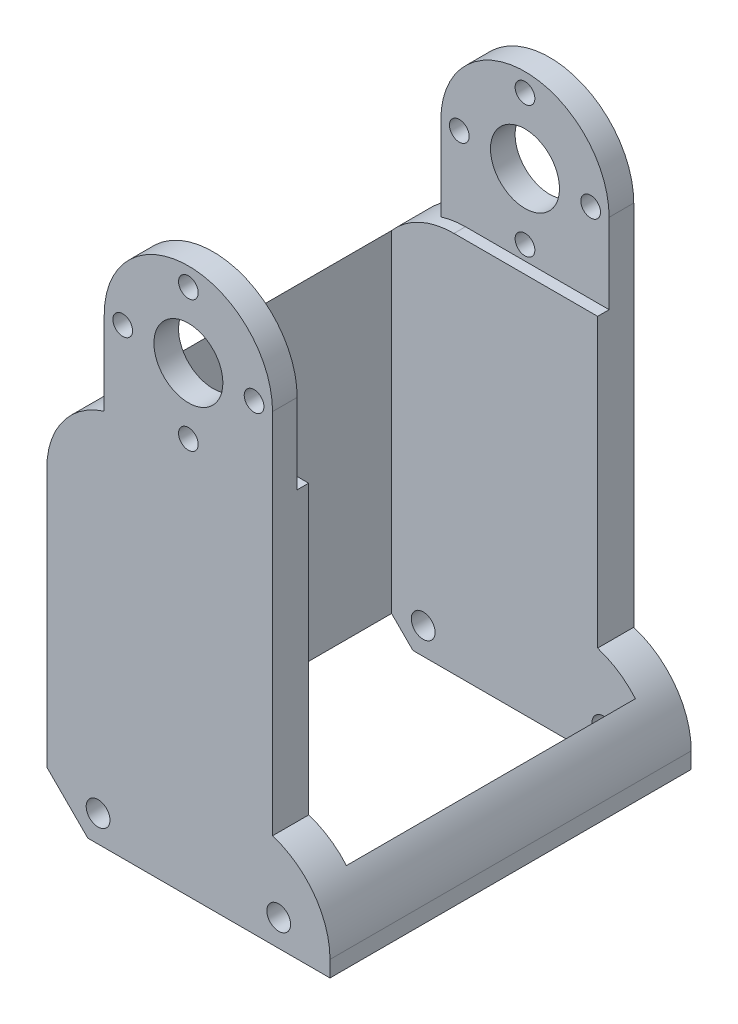
ISO-10303-21;
HEADER;
FILE_DESCRIPTION(('STEP AP214'),'2;1');
FILE_NAME('part.step','',(''),(''),'','','');
FILE_SCHEMA(('AUTOMOTIVE_DESIGN { 1 0 10303 214 1 1 1 1 }'));
ENDSEC;
DATA;
#1=APPLICATION_CONTEXT('core data for automotive mechanical design processes');
#2=APPLICATION_PROTOCOL_DEFINITION('international standard','automotive_design',2000,#1);
#3=PRODUCT_CONTEXT('',#1,'mechanical');
#4=PRODUCT('Part','Part','',(#3));
#5=PRODUCT_RELATED_PRODUCT_CATEGORY('part','',(#4));
#6=PRODUCT_DEFINITION_FORMATION('','',#4);
#7=PRODUCT_DEFINITION_CONTEXT('part definition',#1,'design');
#8=PRODUCT_DEFINITION('design','',#6,#7);
#9=PRODUCT_DEFINITION_SHAPE('','',#8);
#10=(LENGTH_UNIT() NAMED_UNIT(*) SI_UNIT(.MILLI.,.METRE.));
#11=(NAMED_UNIT(*) PLANE_ANGLE_UNIT() SI_UNIT($,.RADIAN.));
#12=(NAMED_UNIT(*) SI_UNIT($,.STERADIAN.) SOLID_ANGLE_UNIT());
#13=UNCERTAINTY_MEASURE_WITH_UNIT(LENGTH_MEASURE(1.E-05),#10,'distance_accuracy_value','');
#14=(GEOMETRIC_REPRESENTATION_CONTEXT(3) GLOBAL_UNCERTAINTY_ASSIGNED_CONTEXT((#13)) GLOBAL_UNIT_ASSIGNED_CONTEXT((#10,
#11,#12)) REPRESENTATION_CONTEXT('',''));
#15=CARTESIAN_POINT('',(0.,0.,0.));
#16=DIRECTION('',(0.,0.,1.));
#17=DIRECTION('',(1.,0.,0.));
#18=AXIS2_PLACEMENT_3D('',#15,#16,#17);
#19=CARTESIAN_POINT('',(10.25,-9.75,-19.));
#20=DIRECTION('',(0.,-1.,0.));
#21=DIRECTION('',(0.,0.,-1.));
#22=AXIS2_PLACEMENT_3D('',#19,#20,#21);
#23=PLANE('',#22);
#24=DIRECTION('',(-1.,0.,0.));
#25=VECTOR('',#24,1.);
#26=CARTESIAN_POINT('',(10.25,-9.75,-19.));
#27=LINE('',#26,#25);
#28=CARTESIAN_POINT('',(10.25,-9.75,-19.));
#29=VERTEX_POINT('',#28);
#30=CARTESIAN_POINT('',(-7.25,-9.75,-19.));
#31=VERTEX_POINT('',#30);
#32=EDGE_CURVE('E391',#29,#31,#27,.T.);
#33=ORIENTED_EDGE('',*,*,#32,.T.);
#34=DIRECTION('',(0.,0.,1.));
#35=VECTOR('',#34,1.);
#36=CARTESIAN_POINT('',(-7.25,-9.75,22.));
#37=LINE('',#36,#35);
#38=CARTESIAN_POINT('',(-7.25,-9.75,-17.6));
#39=VERTEX_POINT('',#38);
#40=EDGE_CURVE('E564',#31,#39,#37,.T.);
#41=ORIENTED_EDGE('',*,*,#40,.T.);
#42=DIRECTION('',(1.,0.,0.));
#43=VECTOR('',#42,1.);
#44=CARTESIAN_POINT('',(10.25,-9.75,-17.6));
#45=LINE('',#44,#43);
#46=CARTESIAN_POINT('',(10.25,-9.75,-17.6));
#47=VERTEX_POINT('',#46);
#48=EDGE_CURVE('E332',#39,#47,#45,.T.);
#49=ORIENTED_EDGE('',*,*,#48,.T.);
#50=DIRECTION('',(0.,0.,-1.));
#51=VECTOR('',#50,1.);
#52=CARTESIAN_POINT('',(10.25,-9.75,22.));
#53=LINE('',#52,#51);
#54=EDGE_CURVE('E291',#47,#29,#53,.T.);
#55=ORIENTED_EDGE('',*,*,#54,.T.);
#56=EDGE_LOOP('',(#33,#41,#49,#55));
#57=FACE_BOUND('',#56,.T.);
#58=ADVANCED_FACE('F108',(#57),#23,.F.);
#59=CARTESIAN_POINT('',(0.,0.,-22.));
#60=DIRECTION('',(0.,0.,1.));
#61=DIRECTION('',(1.,0.,0.));
#62=AXIS2_PLACEMENT_3D('',#59,#60,#61);
#63=PLANE('',#62);
#64=CARTESIAN_POINT('',(-8.,0.,-22.));
#65=DIRECTION('',(0.,0.,1.));
#66=DIRECTION('',(1.,0.,0.));
#67=AXIS2_PLACEMENT_3D('',#64,#65,#66);
#68=CIRCLE('',#67,1.2);
#69=CARTESIAN_POINT('',(-6.8,0.,-22.));
#70=VERTEX_POINT('',#69);
#71=EDGE_CURVE('E467',#70,#70,#68,.T.);
#72=ORIENTED_EDGE('',*,*,#71,.T.);
#73=EDGE_LOOP('',(#72));
#74=FACE_BOUND('',#73,.T.);
#75=CARTESIAN_POINT('',(0.,8.,-22.));
#76=DIRECTION('',(0.,0.,1.));
#77=DIRECTION('',(1.,0.,0.));
#78=AXIS2_PLACEMENT_3D('',#75,#76,#77);
#79=CIRCLE('',#78,1.2);
#80=CARTESIAN_POINT('',(1.2,8.,-22.));
#81=VERTEX_POINT('',#80);
#82=EDGE_CURVE('E471',#81,#81,#79,.T.);
#83=ORIENTED_EDGE('',*,*,#82,.T.);
#84=EDGE_LOOP('',(#83));
#85=FACE_BOUND('',#84,.T.);
#86=CARTESIAN_POINT('',(8.,0.,-22.));
#87=DIRECTION('',(0.,0.,1.));
#88=DIRECTION('',(1.,0.,0.));
#89=AXIS2_PLACEMENT_3D('',#86,#87,#88);
#90=CIRCLE('',#89,1.2);
#91=CARTESIAN_POINT('',(9.2,0.,-22.));
#92=VERTEX_POINT('',#91);
#93=EDGE_CURVE('E475',#92,#92,#90,.T.);
#94=ORIENTED_EDGE('',*,*,#93,.T.);
#95=EDGE_LOOP('',(#94));
#96=FACE_BOUND('',#95,.T.);
#97=CARTESIAN_POINT('',(0.,0.,-22.));
#98=DIRECTION('',(0.,0.,1.));
#99=DIRECTION('',(1.,0.,0.));
#100=AXIS2_PLACEMENT_3D('',#97,#98,#99);
#101=CIRCLE('',#100,4.2);
#102=CARTESIAN_POINT('',(4.2,0.,-22.));
#103=VERTEX_POINT('',#102);
#104=EDGE_CURVE('E479',#103,#103,#101,.T.);
#105=ORIENTED_EDGE('',*,*,#104,.T.);
#106=EDGE_LOOP('',(#105));
#107=FACE_BOUND('',#106,.T.);
#108=CARTESIAN_POINT('',(0.,-8.,-22.));
#109=DIRECTION('',(0.,0.,1.));
#110=DIRECTION('',(1.,0.,0.));
#111=AXIS2_PLACEMENT_3D('',#108,#109,#110);
#112=CIRCLE('',#111,1.2);
#113=CARTESIAN_POINT('',(1.19999999999994,-8.,-22.));
#114=VERTEX_POINT('',#113);
#115=EDGE_CURVE('E493',#114,#114,#112,.T.);
#116=ORIENTED_EDGE('',*,*,#115,.T.);
#117=EDGE_LOOP('',(#116));
#118=FACE_BOUND('',#117,.T.);
#119=CARTESIAN_POINT('',(11.,-53.,-22.));
#120=DIRECTION('',(0.,0.,1.));
#121=DIRECTION('',(1.,0.,0.));
#122=AXIS2_PLACEMENT_3D('',#119,#120,#121);
#123=CIRCLE('',#122,1.45);
#124=CARTESIAN_POINT('',(12.45,-53.,-22.));
#125=VERTEX_POINT('',#124);
#126=EDGE_CURVE('E364',#125,#125,#123,.T.);
#127=ORIENTED_EDGE('',*,*,#126,.T.);
#128=EDGE_LOOP('',(#127));
#129=FACE_BOUND('',#128,.T.);
#130=CARTESIAN_POINT('',(-11.,-53.,-22.));
#131=DIRECTION('',(0.,0.,1.));
#132=DIRECTION('',(1.,0.,0.));
#133=AXIS2_PLACEMENT_3D('',#130,#131,#132);
#134=CIRCLE('',#133,1.45);
#135=CARTESIAN_POINT('',(-9.55,-53.,-22.));
#136=VERTEX_POINT('',#135);
#137=EDGE_CURVE('E352',#136,#136,#134,.T.);
#138=ORIENTED_EDGE('',*,*,#137,.T.);
#139=EDGE_LOOP('',(#138));
#140=FACE_BOUND('',#139,.T.);
#141=CARTESIAN_POINT('',(-7.25,-19.75,-22.));
#142=DIRECTION('',(0.,0.,1.));
#143=DIRECTION('',(1.,0.,0.));
#144=AXIS2_PLACEMENT_3D('',#141,#142,#143);
#145=CIRCLE('',#144,10.);
#146=CARTESIAN_POINT('',(-17.25,-19.75,-22.));
#147=VERTEX_POINT('',#146);
#148=CARTESIAN_POINT('',(-10.25,-10.2106079858305,-22.));
#149=VERTEX_POINT('',#148);
#150=EDGE_CURVE('E583',#147,#149,#145,.F.);
#151=ORIENTED_EDGE('',*,*,#150,.T.);
#152=DIRECTION('',(0.,-1.,0.));
#153=VECTOR('',#152,1.);
#154=CARTESIAN_POINT('',(-10.25,0.,-22.));
#155=LINE('',#154,#153);
#156=CARTESIAN_POINT('',(-10.25,0.,-22.));
#157=VERTEX_POINT('',#156);
#158=EDGE_CURVE('E487',#157,#149,#155,.T.);
#159=ORIENTED_EDGE('',*,*,#158,.F.);
#160=CARTESIAN_POINT('',(0.,0.,-22.));
#161=DIRECTION('',(0.,0.,1.));
#162=DIRECTION('',(1.,0.,0.));
#163=AXIS2_PLACEMENT_3D('',#160,#161,#162);
#164=CIRCLE('',#163,10.25);
#165=CARTESIAN_POINT('',(10.25,0.,-22.));
#166=VERTEX_POINT('',#165);
#167=EDGE_CURVE('E483',#166,#157,#164,.T.);
#168=ORIENTED_EDGE('',*,*,#167,.F.);
#169=DIRECTION('',(0.,-1.,0.));
#170=VECTOR('',#169,1.);
#171=CARTESIAN_POINT('',(10.25,0.,-22.));
#172=LINE('',#171,#170);
#173=CARTESIAN_POINT('',(10.25,-44.75,-22.));
#174=VERTEX_POINT('',#173);
#175=EDGE_CURVE('E490',#166,#174,#172,.T.);
#176=ORIENTED_EDGE('',*,*,#175,.T.);
#177=CARTESIAN_POINT('',(7.25,-54.2893920141695,-22.));
#178=DIRECTION('',(0.,0.,1.));
#179=DIRECTION('',(1.,0.,0.));
#180=AXIS2_PLACEMENT_3D('',#177,#178,#179);
#181=CIRCLE('',#180,10.);
#182=CARTESIAN_POINT('',(17.25,-54.2893920141695,-22.));
#183=VERTEX_POINT('',#182);
#184=EDGE_CURVE('E557',#174,#183,#181,.F.);
#185=ORIENTED_EDGE('',*,*,#184,.T.);
#186=DIRECTION('',(0.,1.,0.));
#187=VECTOR('',#186,1.);
#188=CARTESIAN_POINT('',(17.25,-75.25,-22.));
#189=LINE('',#188,#187);
#190=CARTESIAN_POINT('',(17.25,-56.25,-22.));
#191=VERTEX_POINT('',#190);
#192=EDGE_CURVE('E356',#191,#183,#189,.T.);
#193=ORIENTED_EDGE('',*,*,#192,.F.);
#194=DIRECTION('',(1.,0.,0.));
#195=VECTOR('',#194,1.);
#196=CARTESIAN_POINT('',(0.,-56.25,-22.));
#197=LINE('',#196,#195);
#198=CARTESIAN_POINT('',(-12.25,-56.25,-22.));
#199=VERTEX_POINT('',#198);
#200=EDGE_CURVE('E345',#199,#191,#197,.T.);
#201=ORIENTED_EDGE('',*,*,#200,.F.);
#202=DIRECTION('',(0.707106781186544,-0.707106781186551,0.));
#203=VECTOR('',#202,1.);
#204=CARTESIAN_POINT('',(-17.25,-51.2499999999999,-22.));
#205=LINE('',#204,#203);
#206=CARTESIAN_POINT('',(-17.25,-51.2499999999999,-22.));
#207=VERTEX_POINT('',#206);
#208=EDGE_CURVE('E546',#199,#207,#205,.F.);
#209=ORIENTED_EDGE('',*,*,#208,.T.);
#210=DIRECTION('',(0.,1.,0.));
#211=VECTOR('',#210,1.);
#212=CARTESIAN_POINT('',(-17.25,-75.25,-22.));
#213=LINE('',#212,#211);
#214=EDGE_CURVE('E373',#207,#147,#213,.T.);
#215=ORIENTED_EDGE('',*,*,#214,.T.);
#216=EDGE_LOOP('',(#151,#159,#168,#176,#185,#193,#201,#209,#215));
#217=FACE_BOUND('',#216,.T.);
#218=ADVANCED_FACE('F619',(#74,#85,#96,#107,#118,#129,#140,#217),#63,.F.);
#219=CARTESIAN_POINT('',(0.,0.,22.));
#220=DIRECTION('',(0.,0.,1.));
#221=DIRECTION('',(1.,0.,0.));
#222=AXIS2_PLACEMENT_3D('',#219,#220,#221);
#223=PLANE('',#222);
#224=DIRECTION('',(0.,-1.,0.));
#225=VECTOR('',#224,1.);
#226=CARTESIAN_POINT('',(-10.25,0.,22.));
#227=LINE('',#226,#225);
#228=CARTESIAN_POINT('',(-10.25,0.,22.));
#229=VERTEX_POINT('',#228);
#230=CARTESIAN_POINT('',(-10.25,-10.2106079858305,22.));
#231=VERTEX_POINT('',#230);
#232=EDGE_CURVE('E285',#229,#231,#227,.T.);
#233=ORIENTED_EDGE('',*,*,#232,.T.);
#234=CARTESIAN_POINT('',(-7.25,-19.75,22.));
#235=DIRECTION('',(0.,0.,1.));
#236=DIRECTION('',(1.,0.,0.));
#237=AXIS2_PLACEMENT_3D('',#234,#235,#236);
#238=CIRCLE('',#237,10.);
#239=CARTESIAN_POINT('',(-17.25,-19.75,22.));
#240=VERTEX_POINT('',#239);
#241=EDGE_CURVE('E577',#231,#240,#238,.T.);
#242=ORIENTED_EDGE('',*,*,#241,.T.);
#243=DIRECTION('',(0.,1.,0.));
#244=VECTOR('',#243,1.);
#245=CARTESIAN_POINT('',(-17.25,-75.25,22.));
#246=LINE('',#245,#244);
#247=CARTESIAN_POINT('',(-17.25,-51.2499999999999,22.));
#248=VERTEX_POINT('',#247);
#249=EDGE_CURVE('E377',#248,#240,#246,.T.);
#250=ORIENTED_EDGE('',*,*,#249,.F.);
#251=DIRECTION('',(-0.707106781186544,0.707106781186551,0.));
#252=VECTOR('',#251,1.);
#253=CARTESIAN_POINT('',(-34.25,-34.2499999999997,22.));
#254=LINE('',#253,#252);
#255=CARTESIAN_POINT('',(-12.25,-56.25,22.));
#256=VERTEX_POINT('',#255);
#257=EDGE_CURVE('E526',#248,#256,#254,.F.);
#258=ORIENTED_EDGE('',*,*,#257,.T.);
#259=DIRECTION('',(1.,0.,0.));
#260=VECTOR('',#259,1.);
#261=CARTESIAN_POINT('',(0.,-56.25,22.));
#262=LINE('',#261,#260);
#263=CARTESIAN_POINT('',(17.25,-56.25,22.));
#264=VERTEX_POINT('',#263);
#265=EDGE_CURVE('E349',#256,#264,#262,.T.);
#266=ORIENTED_EDGE('',*,*,#265,.T.);
#267=DIRECTION('',(0.,1.,0.));
#268=VECTOR('',#267,1.);
#269=CARTESIAN_POINT('',(17.25,-75.25,22.));
#270=LINE('',#269,#268);
#271=CARTESIAN_POINT('',(17.25,-54.2893920141695,22.));
#272=VERTEX_POINT('',#271);
#273=EDGE_CURVE('E266',#264,#272,#270,.T.);
#274=ORIENTED_EDGE('',*,*,#273,.T.);
#275=CARTESIAN_POINT('',(7.25,-54.2893920141695,22.));
#276=DIRECTION('',(0.,0.,1.));
#277=DIRECTION('',(1.,0.,0.));
#278=AXIS2_PLACEMENT_3D('',#275,#276,#277);
#279=CIRCLE('',#278,10.);
#280=CARTESIAN_POINT('',(10.25,-44.75,22.));
#281=VERTEX_POINT('',#280);
#282=EDGE_CURVE('E259',#272,#281,#279,.T.);
#283=ORIENTED_EDGE('',*,*,#282,.T.);
#284=DIRECTION('',(0.,-1.,0.));
#285=VECTOR('',#284,1.);
#286=CARTESIAN_POINT('',(10.25,0.,22.));
#287=LINE('',#286,#285);
#288=CARTESIAN_POINT('',(10.25,0.,22.));
#289=VERTEX_POINT('',#288);
#290=EDGE_CURVE('E264',#289,#281,#287,.T.);
#291=ORIENTED_EDGE('',*,*,#290,.F.);
#292=CARTESIAN_POINT('',(0.,0.,22.));
#293=DIRECTION('',(0.,0.,1.));
#294=DIRECTION('',(1.,0.,0.));
#295=AXIS2_PLACEMENT_3D('',#292,#293,#294);
#296=CIRCLE('',#295,10.25);
#297=EDGE_CURVE('E459',#289,#229,#296,.T.);
#298=ORIENTED_EDGE('',*,*,#297,.T.);
#299=EDGE_LOOP('',(#233,#242,#250,#258,#266,#274,#283,#291,#298));
#300=FACE_BOUND('',#299,.T.);
#301=CARTESIAN_POINT('',(0.,-8.,22.));
#302=DIRECTION('',(0.,0.,1.));
#303=DIRECTION('',(1.,0.,0.));
#304=AXIS2_PLACEMENT_3D('',#301,#302,#303);
#305=CIRCLE('',#304,1.2);
#306=CARTESIAN_POINT('',(1.19999999999994,-8.,22.));
#307=VERTEX_POINT('',#306);
#308=EDGE_CURVE('E284',#307,#307,#305,.T.);
#309=ORIENTED_EDGE('',*,*,#308,.F.);
#310=EDGE_LOOP('',(#309));
#311=FACE_BOUND('',#310,.T.);
#312=CARTESIAN_POINT('',(0.,0.,22.));
#313=DIRECTION('',(0.,0.,1.));
#314=DIRECTION('',(1.,0.,0.));
#315=AXIS2_PLACEMENT_3D('',#312,#313,#314);
#316=CIRCLE('',#315,4.2);
#317=CARTESIAN_POINT('',(4.2,0.,22.));
#318=VERTEX_POINT('',#317);
#319=EDGE_CURVE('E455',#318,#318,#316,.T.);
#320=ORIENTED_EDGE('',*,*,#319,.F.);
#321=EDGE_LOOP('',(#320));
#322=FACE_BOUND('',#321,.T.);
#323=CARTESIAN_POINT('',(8.,0.,22.));
#324=DIRECTION('',(0.,0.,1.));
#325=DIRECTION('',(1.,0.,0.));
#326=AXIS2_PLACEMENT_3D('',#323,#324,#325);
#327=CIRCLE('',#326,1.2);
#328=CARTESIAN_POINT('',(9.2,0.,22.));
#329=VERTEX_POINT('',#328);
#330=EDGE_CURVE('E451',#329,#329,#327,.T.);
#331=ORIENTED_EDGE('',*,*,#330,.F.);
#332=EDGE_LOOP('',(#331));
#333=FACE_BOUND('',#332,.T.);
#334=CARTESIAN_POINT('',(0.,8.,22.));
#335=DIRECTION('',(0.,0.,1.));
#336=DIRECTION('',(1.,0.,0.));
#337=AXIS2_PLACEMENT_3D('',#334,#335,#336);
#338=CIRCLE('',#337,1.2);
#339=CARTESIAN_POINT('',(1.2,8.,22.));
#340=VERTEX_POINT('',#339);
#341=EDGE_CURVE('E447',#340,#340,#338,.T.);
#342=ORIENTED_EDGE('',*,*,#341,.F.);
#343=EDGE_LOOP('',(#342));
#344=FACE_BOUND('',#343,.T.);
#345=CARTESIAN_POINT('',(-8.,0.,22.));
#346=DIRECTION('',(0.,0.,1.));
#347=DIRECTION('',(1.,0.,0.));
#348=AXIS2_PLACEMENT_3D('',#345,#346,#347);
#349=CIRCLE('',#348,1.2);
#350=CARTESIAN_POINT('',(-6.8,0.,22.));
#351=VERTEX_POINT('',#350);
#352=EDGE_CURVE('E443',#351,#351,#349,.T.);
#353=ORIENTED_EDGE('',*,*,#352,.F.);
#354=EDGE_LOOP('',(#353));
#355=FACE_BOUND('',#354,.T.);
#356=CARTESIAN_POINT('',(11.,-53.,22.));
#357=DIRECTION('',(0.,0.,1.));
#358=DIRECTION('',(1.,0.,0.));
#359=AXIS2_PLACEMENT_3D('',#356,#357,#358);
#360=CIRCLE('',#359,1.45);
#361=CARTESIAN_POINT('',(12.45,-53.,22.));
#362=VERTEX_POINT('',#361);
#363=EDGE_CURVE('E344',#362,#362,#360,.T.);
#364=ORIENTED_EDGE('',*,*,#363,.F.);
#365=EDGE_LOOP('',(#364));
#366=FACE_BOUND('',#365,.T.);
#367=CARTESIAN_POINT('',(-11.,-53.,22.));
#368=DIRECTION('',(0.,0.,1.));
#369=DIRECTION('',(1.,0.,0.));
#370=AXIS2_PLACEMENT_3D('',#367,#368,#369);
#371=CIRCLE('',#370,1.45);
#372=CARTESIAN_POINT('',(-9.55,-53.,22.));
#373=VERTEX_POINT('',#372);
#374=EDGE_CURVE('E360',#373,#373,#371,.T.);
#375=ORIENTED_EDGE('',*,*,#374,.F.);
#376=EDGE_LOOP('',(#375));
#377=FACE_BOUND('',#376,.T.);
#378=ADVANCED_FACE('F261',(#300,#311,#322,#333,#344,#355,#366,#377),#223,.T.);
#379=CARTESIAN_POINT('',(-17.25,-75.25,-22.));
#380=DIRECTION('',(-1.,0.,0.));
#381=DIRECTION('',(0.,0.,1.));
#382=AXIS2_PLACEMENT_3D('',#379,#380,#381);
#383=PLANE('',#382);
#384=ORIENTED_EDGE('',*,*,#249,.T.);
#385=DIRECTION('',(0.,0.,1.));
#386=VECTOR('',#385,1.);
#387=CARTESIAN_POINT('',(-17.25,-19.75,-22.));
#388=LINE('',#387,#386);
#389=EDGE_CURVE('E580',#240,#147,#388,.F.);
#390=ORIENTED_EDGE('',*,*,#389,.T.);
#391=ORIENTED_EDGE('',*,*,#214,.F.);
#392=DIRECTION('',(0.,0.,1.));
#393=VECTOR('',#392,1.);
#394=CARTESIAN_POINT('',(-17.25,-51.2499999999999,-22.));
#395=LINE('',#394,#393);
#396=EDGE_CURVE('E522',#207,#248,#395,.T.);
#397=ORIENTED_EDGE('',*,*,#396,.T.);
#398=EDGE_LOOP('',(#384,#390,#391,#397));
#399=FACE_BOUND('',#398,.T.);
#400=ADVANCED_FACE('F684',(#399),#383,.T.);
#401=CARTESIAN_POINT('',(17.25,-75.25,-22.));
#402=DIRECTION('',(1.,0.,0.));
#403=DIRECTION('',(0.,0.,-1.));
#404=AXIS2_PLACEMENT_3D('',#401,#402,#403);
#405=PLANE('',#404);
#406=ORIENTED_EDGE('',*,*,#192,.T.);
#407=DIRECTION('',(0.,0.,1.));
#408=VECTOR('',#407,1.);
#409=CARTESIAN_POINT('',(17.25,-54.2893920141695,22.));
#410=LINE('',#409,#408);
#411=EDGE_CURVE('E272',#183,#272,#410,.T.);
#412=ORIENTED_EDGE('',*,*,#411,.T.);
#413=ORIENTED_EDGE('',*,*,#273,.F.);
#414=DIRECTION('',(0.,0.,1.));
#415=VECTOR('',#414,1.);
#416=CARTESIAN_POINT('',(17.25,-56.25,-22.));
#417=LINE('',#416,#415);
#418=EDGE_CURVE('E348',#191,#264,#417,.T.);
#419=ORIENTED_EDGE('',*,*,#418,.F.);
#420=EDGE_LOOP('',(#406,#412,#413,#419));
#421=FACE_BOUND('',#420,.T.);
#422=ADVANCED_FACE('F699',(#421),#405,.T.);
#423=CARTESIAN_POINT('',(10.25,0.,-22.));
#424=DIRECTION('',(-1.,0.,0.));
#425=DIRECTION('',(0.,0.,1.));
#426=AXIS2_PLACEMENT_3D('',#423,#424,#425);
#427=PLANE('',#426);
#428=ORIENTED_EDGE('',*,*,#290,.T.);
#429=DIRECTION('',(0.,0.,-1.));
#430=VECTOR('',#429,1.);
#431=CARTESIAN_POINT('',(10.25,-44.75,22.));
#432=LINE('',#431,#430);
#433=CARTESIAN_POINT('',(10.25,-44.75,17.6));
#434=VERTEX_POINT('',#433);
#435=EDGE_CURVE('E277',#281,#434,#432,.T.);
#436=ORIENTED_EDGE('',*,*,#435,.T.);
#437=DIRECTION('',(0.,-1.,0.));
#438=VECTOR('',#437,1.);
#439=CARTESIAN_POINT('',(10.25,10.25,17.6));
#440=LINE('',#439,#438);
#441=CARTESIAN_POINT('',(10.25,-9.75,17.6));
#442=VERTEX_POINT('',#441);
#443=EDGE_CURVE('E300',#442,#434,#440,.T.);
#444=ORIENTED_EDGE('',*,*,#443,.F.);
#445=CARTESIAN_POINT('',(10.25,-9.75,19.));
#446=VERTEX_POINT('',#445);
#447=EDGE_CURVE('E296',#446,#442,#53,.T.);
#448=ORIENTED_EDGE('',*,*,#447,.F.);
#449=DIRECTION('',(0.,1.,0.));
#450=VECTOR('',#449,1.);
#451=CARTESIAN_POINT('',(10.25,10.25,19.));
#452=LINE('',#451,#450);
#453=CARTESIAN_POINT('',(10.25,0.,19.));
#454=VERTEX_POINT('',#453);
#455=EDGE_CURVE('E388',#446,#454,#452,.T.);
#456=ORIENTED_EDGE('',*,*,#455,.T.);
#457=DIRECTION('',(0.,0.,1.));
#458=VECTOR('',#457,1.);
#459=CARTESIAN_POINT('',(10.25,0.,-22.));
#460=LINE('',#459,#458);
#461=EDGE_CURVE('E281',#454,#289,#460,.T.);
#462=ORIENTED_EDGE('',*,*,#461,.T.);
#463=EDGE_LOOP('',(#428,#436,#444,#448,#456,#462));
#464=FACE_BOUND('',#463,.T.);
#465=ADVANCED_FACE('F276',(#464),#427,.F.);
#466=CARTESIAN_POINT('',(-10.25,0.,-22.));
#467=DIRECTION('',(-1.,0.,0.));
#468=DIRECTION('',(0.,0.,1.));
#469=AXIS2_PLACEMENT_3D('',#466,#467,#468);
#470=PLANE('',#469);
#471=ORIENTED_EDGE('',*,*,#158,.T.);
#472=DIRECTION('',(0.,0.,-1.));
#473=VECTOR('',#472,1.);
#474=CARTESIAN_POINT('',(-10.25,-10.2106079858305,-22.));
#475=LINE('',#474,#473);
#476=CARTESIAN_POINT('',(-10.25,-10.2106079858305,-19.));
#477=VERTEX_POINT('',#476);
#478=EDGE_CURVE('E117',#149,#477,#475,.F.);
#479=ORIENTED_EDGE('',*,*,#478,.T.);
#480=DIRECTION('',(0.,-1.,0.));
#481=VECTOR('',#480,1.);
#482=CARTESIAN_POINT('',(-10.25,10.25,-19.));
#483=LINE('',#482,#481);
#484=CARTESIAN_POINT('',(-10.25,0.,-19.));
#485=VERTEX_POINT('',#484);
#486=EDGE_CURVE('E123',#485,#477,#483,.T.);
#487=ORIENTED_EDGE('',*,*,#486,.F.);
#488=DIRECTION('',(0.,0.,1.));
#489=VECTOR('',#488,1.);
#490=CARTESIAN_POINT('',(-10.25,0.,-22.));
#491=LINE('',#490,#489);
#492=EDGE_CURVE('E503',#157,#485,#491,.T.);
#493=ORIENTED_EDGE('',*,*,#492,.F.);
#494=EDGE_LOOP('',(#471,#479,#487,#493));
#495=FACE_BOUND('',#494,.T.);
#496=ADVANCED_FACE('F596',(#495),#470,.T.);
#497=DIRECTION('',(0.,1.,0.));
#498=VECTOR('',#497,1.);
#499=CARTESIAN_POINT('',(-10.25,10.25,19.));
#500=LINE('',#499,#498);
#501=CARTESIAN_POINT('',(-10.25,-10.2106079858305,19.));
#502=VERTEX_POINT('',#501);
#503=CARTESIAN_POINT('',(-10.25,0.,19.));
#504=VERTEX_POINT('',#503);
#505=EDGE_CURVE('E131',#502,#504,#500,.T.);
#506=ORIENTED_EDGE('',*,*,#505,.F.);
#507=DIRECTION('',(0.,0.,-1.));
#508=VECTOR('',#507,1.);
#509=CARTESIAN_POINT('',(-10.25,-10.2106079858305,19.));
#510=LINE('',#509,#508);
#511=EDGE_CURVE('E590',#502,#231,#510,.F.);
#512=ORIENTED_EDGE('',*,*,#511,.T.);
#513=ORIENTED_EDGE('',*,*,#232,.F.);
#514=EDGE_CURVE('E497',#504,#229,#491,.T.);
#515=ORIENTED_EDGE('',*,*,#514,.F.);
#516=EDGE_LOOP('',(#506,#512,#513,#515));
#517=FACE_BOUND('',#516,.T.);
#518=ADVANCED_FACE('F625',(#517),#470,.T.);
#519=CARTESIAN_POINT('',(0.,0.,-22.));
#520=DIRECTION('',(0.,0.,1.));
#521=DIRECTION('',(1.,0.,0.));
#522=AXIS2_PLACEMENT_3D('',#519,#520,#521);
#523=CYLINDRICAL_SURFACE('',#522,10.25);
#524=CARTESIAN_POINT('',(0.,0.,-19.));
#525=DIRECTION('',(0.,0.,-1.));
#526=DIRECTION('',(-1.,0.,0.));
#527=AXIS2_PLACEMENT_3D('',#524,#525,#526);
#528=CIRCLE('',#527,10.25);
#529=CARTESIAN_POINT('',(10.25,0.,-19.));
#530=VERTEX_POINT('',#529);
#531=EDGE_CURVE('E440',#530,#485,#528,.F.);
#532=ORIENTED_EDGE('',*,*,#531,.F.);
#533=EDGE_CURVE('E498',#166,#530,#460,.T.);
#534=ORIENTED_EDGE('',*,*,#533,.F.);
#535=ORIENTED_EDGE('',*,*,#167,.T.);
#536=ORIENTED_EDGE('',*,*,#492,.T.);
#537=EDGE_LOOP('',(#532,#534,#535,#536));
#538=FACE_BOUND('',#537,.T.);
#539=ADVANCED_FACE('F622',(#538),#523,.T.);
#540=CARTESIAN_POINT('',(0.,0.,-22.));
#541=DIRECTION('',(0.,0.,1.));
#542=DIRECTION('',(1.,0.,0.));
#543=AXIS2_PLACEMENT_3D('',#540,#541,#542);
#544=CYLINDRICAL_SURFACE('',#543,4.2);
#545=CARTESIAN_POINT('',(0.,0.,-19.));
#546=DIRECTION('',(0.,0.,-1.));
#547=DIRECTION('',(-1.,0.,0.));
#548=AXIS2_PLACEMENT_3D('',#545,#546,#547);
#549=CIRCLE('',#548,4.2);
#550=CARTESIAN_POINT('',(-4.2,0.,-19.));
#551=VERTEX_POINT('',#550);
#552=EDGE_CURVE('E436',#551,#551,#549,.F.);
#553=ORIENTED_EDGE('',*,*,#552,.T.);
#554=EDGE_LOOP('',(#553));
#555=FACE_BOUND('',#554,.T.);
#556=ORIENTED_EDGE('',*,*,#104,.F.);
#557=EDGE_LOOP('',(#556));
#558=FACE_BOUND('',#557,.T.);
#559=ADVANCED_FACE('F624',(#555,#558),#544,.F.);
#560=CARTESIAN_POINT('',(8.,0.,-22.));
#561=DIRECTION('',(0.,0.,1.));
#562=DIRECTION('',(1.,0.,0.));
#563=AXIS2_PLACEMENT_3D('',#560,#561,#562);
#564=CYLINDRICAL_SURFACE('',#563,1.2);
#565=CARTESIAN_POINT('',(8.,0.,-19.));
#566=DIRECTION('',(0.,0.,-1.));
#567=DIRECTION('',(-1.,0.,0.));
#568=AXIS2_PLACEMENT_3D('',#565,#566,#567);
#569=CIRCLE('',#568,1.2);
#570=CARTESIAN_POINT('',(6.8,0.,-19.));
#571=VERTEX_POINT('',#570);
#572=EDGE_CURVE('E432',#571,#571,#569,.F.);
#573=ORIENTED_EDGE('',*,*,#572,.T.);
#574=EDGE_LOOP('',(#573));
#575=FACE_BOUND('',#574,.T.);
#576=ORIENTED_EDGE('',*,*,#93,.F.);
#577=EDGE_LOOP('',(#576));
#578=FACE_BOUND('',#577,.T.);
#579=ADVANCED_FACE('F631',(#575,#578),#564,.F.);
#580=CARTESIAN_POINT('',(0.,8.,-22.));
#581=DIRECTION('',(0.,0.,1.));
#582=DIRECTION('',(1.,0.,0.));
#583=AXIS2_PLACEMENT_3D('',#580,#581,#582);
#584=CYLINDRICAL_SURFACE('',#583,1.2);
#585=CARTESIAN_POINT('',(0.,8.,-19.));
#586=DIRECTION('',(0.,0.,-1.));
#587=DIRECTION('',(-1.,0.,0.));
#588=AXIS2_PLACEMENT_3D('',#585,#586,#587);
#589=CIRCLE('',#588,1.2);
#590=CARTESIAN_POINT('',(-1.2,8.,-19.));
#591=VERTEX_POINT('',#590);
#592=EDGE_CURVE('E428',#591,#591,#589,.F.);
#593=ORIENTED_EDGE('',*,*,#592,.T.);
#594=EDGE_LOOP('',(#593));
#595=FACE_BOUND('',#594,.T.);
#596=ORIENTED_EDGE('',*,*,#82,.F.);
#597=EDGE_LOOP('',(#596));
#598=FACE_BOUND('',#597,.T.);
#599=ADVANCED_FACE('F762',(#595,#598),#584,.F.);
#600=CARTESIAN_POINT('',(-8.,0.,-22.));
#601=DIRECTION('',(0.,0.,1.));
#602=DIRECTION('',(1.,0.,0.));
#603=AXIS2_PLACEMENT_3D('',#600,#601,#602);
#604=CYLINDRICAL_SURFACE('',#603,1.2);
#605=CARTESIAN_POINT('',(-8.,0.,-19.));
#606=DIRECTION('',(0.,0.,-1.));
#607=DIRECTION('',(-1.,0.,0.));
#608=AXIS2_PLACEMENT_3D('',#605,#606,#607);
#609=CIRCLE('',#608,1.2);
#610=CARTESIAN_POINT('',(-9.2,0.,-19.));
#611=VERTEX_POINT('',#610);
#612=EDGE_CURVE('E424',#611,#611,#609,.F.);
#613=ORIENTED_EDGE('',*,*,#612,.T.);
#614=EDGE_LOOP('',(#613));
#615=FACE_BOUND('',#614,.T.);
#616=ORIENTED_EDGE('',*,*,#71,.F.);
#617=EDGE_LOOP('',(#616));
#618=FACE_BOUND('',#617,.T.);
#619=ADVANCED_FACE('F757',(#615,#618),#604,.F.);
#620=CARTESIAN_POINT('',(0.,-8.,-22.));
#621=DIRECTION('',(0.,0.,1.));
#622=DIRECTION('',(1.,0.,0.));
#623=AXIS2_PLACEMENT_3D('',#620,#621,#622);
#624=CYLINDRICAL_SURFACE('',#623,1.2);
#625=CARTESIAN_POINT('',(0.,-8.,-19.));
#626=DIRECTION('',(0.,0.,-1.));
#627=DIRECTION('',(-1.,0.,0.));
#628=AXIS2_PLACEMENT_3D('',#625,#626,#627);
#629=CIRCLE('',#628,1.2);
#630=CARTESIAN_POINT('',(-1.20000000000006,-8.,-19.));
#631=VERTEX_POINT('',#630);
#632=EDGE_CURVE('E423',#631,#631,#629,.F.);
#633=ORIENTED_EDGE('',*,*,#632,.T.);
#634=EDGE_LOOP('',(#633));
#635=FACE_BOUND('',#634,.T.);
#636=ORIENTED_EDGE('',*,*,#115,.F.);
#637=EDGE_LOOP('',(#636));
#638=FACE_BOUND('',#637,.T.);
#639=ADVANCED_FACE('F638',(#635,#638),#624,.F.);
#640=CARTESIAN_POINT('',(0.,0.,19.));
#641=DIRECTION('',(0.,0.,1.));
#642=DIRECTION('',(0.,-1.,0.));
#643=AXIS2_PLACEMENT_3D('',#640,#641,#642);
#644=CIRCLE('',#643,10.25);
#645=EDGE_CURVE('E420',#504,#454,#644,.F.);
#646=ORIENTED_EDGE('',*,*,#645,.F.);
#647=ORIENTED_EDGE('',*,*,#514,.T.);
#648=ORIENTED_EDGE('',*,*,#297,.F.);
#649=ORIENTED_EDGE('',*,*,#461,.F.);
#650=EDGE_LOOP('',(#646,#647,#648,#649));
#651=FACE_BOUND('',#650,.T.);
#652=ADVANCED_FACE('F627',(#651),#523,.T.);
#653=DIRECTION('',(0.,-1.,0.));
#654=VECTOR('',#653,1.);
#655=CARTESIAN_POINT('',(10.25,10.25,-19.));
#656=LINE('',#655,#654);
#657=EDGE_CURVE('E384',#530,#29,#656,.T.);
#658=ORIENTED_EDGE('',*,*,#657,.T.);
#659=ORIENTED_EDGE('',*,*,#54,.F.);
#660=DIRECTION('',(0.,1.,0.));
#661=VECTOR('',#660,1.);
#662=CARTESIAN_POINT('',(10.25,10.25,-17.6));
#663=LINE('',#662,#661);
#664=CARTESIAN_POINT('',(10.25,-44.75,-17.6));
#665=VERTEX_POINT('',#664);
#666=EDGE_CURVE('E502',#665,#47,#663,.T.);
#667=ORIENTED_EDGE('',*,*,#666,.F.);
#668=EDGE_CURVE('E292',#665,#174,#432,.T.);
#669=ORIENTED_EDGE('',*,*,#668,.T.);
#670=ORIENTED_EDGE('',*,*,#175,.F.);
#671=ORIENTED_EDGE('',*,*,#533,.T.);
#672=EDGE_LOOP('',(#658,#659,#667,#669,#670,#671));
#673=FACE_BOUND('',#672,.T.);
#674=ADVANCED_FACE('F609',(#673),#427,.F.);
#675=CARTESIAN_POINT('',(0.,0.,19.));
#676=DIRECTION('',(0.,0.,1.));
#677=DIRECTION('',(0.,-1.,0.));
#678=AXIS2_PLACEMENT_3D('',#675,#676,#677);
#679=CIRCLE('',#678,4.2);
#680=CARTESIAN_POINT('',(0.,-4.2,19.));
#681=VERTEX_POINT('',#680);
#682=EDGE_CURVE('E416',#681,#681,#679,.F.);
#683=ORIENTED_EDGE('',*,*,#682,.T.);
#684=EDGE_LOOP('',(#683));
#685=FACE_BOUND('',#684,.T.);
#686=ORIENTED_EDGE('',*,*,#319,.T.);
#687=EDGE_LOOP('',(#686));
#688=FACE_BOUND('',#687,.T.);
#689=ADVANCED_FACE('F634',(#685,#688),#544,.F.);
#690=CARTESIAN_POINT('',(8.,0.,19.));
#691=DIRECTION('',(0.,0.,1.));
#692=DIRECTION('',(0.,-1.,0.));
#693=AXIS2_PLACEMENT_3D('',#690,#691,#692);
#694=CIRCLE('',#693,1.2);
#695=CARTESIAN_POINT('',(8.,-1.20000000000003,19.));
#696=VERTEX_POINT('',#695);
#697=EDGE_CURVE('E412',#696,#696,#694,.F.);
#698=ORIENTED_EDGE('',*,*,#697,.T.);
#699=EDGE_LOOP('',(#698));
#700=FACE_BOUND('',#699,.T.);
#701=ORIENTED_EDGE('',*,*,#330,.T.);
#702=EDGE_LOOP('',(#701));
#703=FACE_BOUND('',#702,.T.);
#704=ADVANCED_FACE('F760',(#700,#703),#564,.F.);
#705=CARTESIAN_POINT('',(0.,8.,19.));
#706=DIRECTION('',(0.,0.,1.));
#707=DIRECTION('',(0.,-1.,0.));
#708=AXIS2_PLACEMENT_3D('',#705,#706,#707);
#709=CIRCLE('',#708,1.2);
#710=CARTESIAN_POINT('',(0.,6.8,19.));
#711=VERTEX_POINT('',#710);
#712=EDGE_CURVE('E408',#711,#711,#709,.F.);
#713=ORIENTED_EDGE('',*,*,#712,.T.);
#714=EDGE_LOOP('',(#713));
#715=FACE_BOUND('',#714,.T.);
#716=ORIENTED_EDGE('',*,*,#341,.T.);
#717=EDGE_LOOP('',(#716));
#718=FACE_BOUND('',#717,.T.);
#719=ADVANCED_FACE('F755',(#715,#718),#584,.F.);
#720=CARTESIAN_POINT('',(-8.,0.,19.));
#721=DIRECTION('',(0.,0.,1.));
#722=DIRECTION('',(0.,-1.,0.));
#723=AXIS2_PLACEMENT_3D('',#720,#721,#722);
#724=CIRCLE('',#723,1.2);
#725=CARTESIAN_POINT('',(-8.,-1.19999999999992,19.));
#726=VERTEX_POINT('',#725);
#727=EDGE_CURVE('E404',#726,#726,#724,.F.);
#728=ORIENTED_EDGE('',*,*,#727,.T.);
#729=EDGE_LOOP('',(#728));
#730=FACE_BOUND('',#729,.T.);
#731=ORIENTED_EDGE('',*,*,#352,.T.);
#732=EDGE_LOOP('',(#731));
#733=FACE_BOUND('',#732,.T.);
#734=ADVANCED_FACE('F751',(#730,#733),#604,.F.);
#735=CARTESIAN_POINT('',(0.,-8.,19.));
#736=DIRECTION('',(0.,0.,1.));
#737=DIRECTION('',(0.,-1.,0.));
#738=AXIS2_PLACEMENT_3D('',#735,#736,#737);
#739=CIRCLE('',#738,1.2);
#740=CARTESIAN_POINT('',(0.,-9.2,19.));
#741=VERTEX_POINT('',#740);
#742=EDGE_CURVE('E400',#741,#741,#739,.F.);
#743=ORIENTED_EDGE('',*,*,#742,.T.);
#744=EDGE_LOOP('',(#743));
#745=FACE_BOUND('',#744,.T.);
#746=ORIENTED_EDGE('',*,*,#308,.T.);
#747=EDGE_LOOP('',(#746));
#748=FACE_BOUND('',#747,.T.);
#749=ADVANCED_FACE('F754',(#745,#748),#624,.F.);
#750=CARTESIAN_POINT('',(10.25,10.25,-19.));
#751=DIRECTION('',(0.,0.,-1.));
#752=DIRECTION('',(-1.,0.,0.));
#753=AXIS2_PLACEMENT_3D('',#750,#751,#752);
#754=PLANE('',#753);
#755=ORIENTED_EDGE('',*,*,#531,.T.);
#756=ORIENTED_EDGE('',*,*,#486,.T.);
#757=CARTESIAN_POINT('',(-7.25,-19.75,-19.));
#758=DIRECTION('',(0.,0.,-1.));
#759=DIRECTION('',(-1.,0.,0.));
#760=AXIS2_PLACEMENT_3D('',#757,#758,#759);
#761=CIRCLE('',#760,10.);
#762=EDGE_CURVE('E12',#477,#31,#761,.T.);
#763=ORIENTED_EDGE('',*,*,#762,.T.);
#764=ORIENTED_EDGE('',*,*,#32,.F.);
#765=ORIENTED_EDGE('',*,*,#657,.F.);
#766=EDGE_LOOP('',(#755,#756,#763,#764,#765));
#767=FACE_BOUND('',#766,.T.);
#768=ORIENTED_EDGE('',*,*,#572,.F.);
#769=EDGE_LOOP('',(#768));
#770=FACE_BOUND('',#769,.T.);
#771=ORIENTED_EDGE('',*,*,#612,.F.);
#772=EDGE_LOOP('',(#771));
#773=FACE_BOUND('',#772,.T.);
#774=ORIENTED_EDGE('',*,*,#632,.F.);
#775=EDGE_LOOP('',(#774));
#776=FACE_BOUND('',#775,.T.);
#777=ORIENTED_EDGE('',*,*,#592,.F.);
#778=EDGE_LOOP('',(#777));
#779=FACE_BOUND('',#778,.T.);
#780=ORIENTED_EDGE('',*,*,#552,.F.);
#781=EDGE_LOOP('',(#780));
#782=FACE_BOUND('',#781,.T.);
#783=ADVANCED_FACE('F602',(#767,#770,#773,#776,#779,#782),#754,.F.);
#784=CARTESIAN_POINT('',(10.25,10.25,19.));
#785=DIRECTION('',(0.,0.,1.));
#786=DIRECTION('',(0.,-1.,0.));
#787=AXIS2_PLACEMENT_3D('',#784,#785,#786);
#788=PLANE('',#787);
#789=ORIENTED_EDGE('',*,*,#645,.T.);
#790=ORIENTED_EDGE('',*,*,#455,.F.);
#791=DIRECTION('',(-1.,0.,0.));
#792=VECTOR('',#791,1.);
#793=CARTESIAN_POINT('',(10.25,-9.75,19.));
#794=LINE('',#793,#792);
#795=CARTESIAN_POINT('',(-7.24999999999999,-9.75,19.));
#796=VERTEX_POINT('',#795);
#797=EDGE_CURVE('E396',#446,#796,#794,.T.);
#798=ORIENTED_EDGE('',*,*,#797,.T.);
#799=CARTESIAN_POINT('',(-7.25,-19.75,19.));
#800=DIRECTION('',(0.,0.,1.));
#801=DIRECTION('',(0.,-1.,0.));
#802=AXIS2_PLACEMENT_3D('',#799,#800,#801);
#803=CIRCLE('',#802,10.);
#804=EDGE_CURVE('E587',#796,#502,#803,.T.);
#805=ORIENTED_EDGE('',*,*,#804,.T.);
#806=ORIENTED_EDGE('',*,*,#505,.T.);
#807=EDGE_LOOP('',(#789,#790,#798,#805,#806));
#808=FACE_BOUND('',#807,.T.);
#809=ORIENTED_EDGE('',*,*,#697,.F.);
#810=EDGE_LOOP('',(#809));
#811=FACE_BOUND('',#810,.T.);
#812=ORIENTED_EDGE('',*,*,#727,.F.);
#813=EDGE_LOOP('',(#812));
#814=FACE_BOUND('',#813,.T.);
#815=ORIENTED_EDGE('',*,*,#742,.F.);
#816=EDGE_LOOP('',(#815));
#817=FACE_BOUND('',#816,.T.);
#818=ORIENTED_EDGE('',*,*,#712,.F.);
#819=EDGE_LOOP('',(#818));
#820=FACE_BOUND('',#819,.T.);
#821=ORIENTED_EDGE('',*,*,#682,.F.);
#822=EDGE_LOOP('',(#821));
#823=FACE_BOUND('',#822,.T.);
#824=ADVANCED_FACE('F653',(#808,#811,#814,#817,#820,#823),#788,.F.);
#825=DIRECTION('',(-1.,0.,0.));
#826=VECTOR('',#825,1.);
#827=CARTESIAN_POINT('',(10.25,-9.75,17.6));
#828=LINE('',#827,#826);
#829=CARTESIAN_POINT('',(-7.25,-9.75,17.6));
#830=VERTEX_POINT('',#829);
#831=EDGE_CURVE('E340',#442,#830,#828,.T.);
#832=ORIENTED_EDGE('',*,*,#831,.T.);
#833=DIRECTION('',(0.,0.,1.));
#834=VECTOR('',#833,1.);
#835=CARTESIAN_POINT('',(-7.25,-9.75,22.));
#836=LINE('',#835,#834);
#837=EDGE_CURVE('E271',#830,#796,#836,.T.);
#838=ORIENTED_EDGE('',*,*,#837,.T.);
#839=ORIENTED_EDGE('',*,*,#797,.F.);
#840=ORIENTED_EDGE('',*,*,#447,.T.);
#841=EDGE_LOOP('',(#832,#838,#839,#840));
#842=FACE_BOUND('',#841,.T.);
#843=ADVANCED_FACE('F642',(#842),#23,.F.);
#844=CARTESIAN_POINT('',(0.,-56.25,-22.));
#845=DIRECTION('',(0.,-1.,0.));
#846=DIRECTION('',(0.,0.,-1.));
#847=AXIS2_PLACEMENT_3D('',#844,#845,#846);
#848=PLANE('',#847);
#849=ORIENTED_EDGE('',*,*,#265,.F.);
#850=DIRECTION('',(0.,0.,-1.));
#851=VECTOR('',#850,1.);
#852=CARTESIAN_POINT('',(-12.25,-56.25,-22.));
#853=LINE('',#852,#851);
#854=CARTESIAN_POINT('',(-12.25,-56.25,17.6));
#855=VERTEX_POINT('',#854);
#856=EDGE_CURVE('E532',#256,#855,#853,.T.);
#857=ORIENTED_EDGE('',*,*,#856,.T.);
#858=DIRECTION('',(-1.,0.,0.));
#859=VECTOR('',#858,1.);
#860=CARTESIAN_POINT('',(-14.85,-56.25,17.6));
#861=LINE('',#860,#859);
#862=CARTESIAN_POINT('',(14.85,-56.25,17.6));
#863=VERTEX_POINT('',#862);
#864=EDGE_CURVE('E307',#863,#855,#861,.T.);
#865=ORIENTED_EDGE('',*,*,#864,.F.);
#866=DIRECTION('',(0.,0.,1.));
#867=VECTOR('',#866,1.);
#868=CARTESIAN_POINT('',(14.85,-56.25,-17.6));
#869=LINE('',#868,#867);
#870=CARTESIAN_POINT('',(14.85,-56.25,-17.6));
#871=VERTEX_POINT('',#870);
#872=EDGE_CURVE('E303',#871,#863,#869,.T.);
#873=ORIENTED_EDGE('',*,*,#872,.F.);
#874=DIRECTION('',(1.,0.,0.));
#875=VECTOR('',#874,1.);
#876=CARTESIAN_POINT('',(-14.85,-56.25,-17.6));
#877=LINE('',#876,#875);
#878=CARTESIAN_POINT('',(-12.25,-56.25,-17.6));
#879=VERTEX_POINT('',#878);
#880=EDGE_CURVE('E311',#879,#871,#877,.T.);
#881=ORIENTED_EDGE('',*,*,#880,.F.);
#882=DIRECTION('',(0.,0.,-1.));
#883=VECTOR('',#882,1.);
#884=CARTESIAN_POINT('',(-12.25,-56.25,-22.));
#885=LINE('',#884,#883);
#886=EDGE_CURVE('E529',#879,#199,#885,.T.);
#887=ORIENTED_EDGE('',*,*,#886,.T.);
#888=ORIENTED_EDGE('',*,*,#200,.T.);
#889=ORIENTED_EDGE('',*,*,#418,.T.);
#890=EDGE_LOOP('',(#849,#857,#865,#873,#881,#887,#888,#889));
#891=FACE_BOUND('',#890,.T.);
#892=ADVANCED_FACE('F652',(#891),#848,.T.);
#893=CARTESIAN_POINT('',(11.,-53.,-22.));
#894=DIRECTION('',(0.,0.,1.));
#895=DIRECTION('',(1.,0.,0.));
#896=AXIS2_PLACEMENT_3D('',#893,#894,#895);
#897=CYLINDRICAL_SURFACE('',#896,1.45);
#898=CARTESIAN_POINT('',(11.,-53.,17.6));
#899=DIRECTION('',(0.,0.,1.));
#900=DIRECTION('',(1.,0.,0.));
#901=AXIS2_PLACEMENT_3D('',#898,#899,#900);
#902=CIRCLE('',#901,1.45);
#903=CARTESIAN_POINT('',(12.45,-53.,17.6));
#904=VERTEX_POINT('',#903);
#905=EDGE_CURVE('E336',#904,#904,#902,.F.);
#906=ORIENTED_EDGE('',*,*,#905,.T.);
#907=EDGE_LOOP('',(#906));
#908=FACE_BOUND('',#907,.T.);
#909=ORIENTED_EDGE('',*,*,#363,.T.);
#910=EDGE_LOOP('',(#909));
#911=FACE_BOUND('',#910,.T.);
#912=ADVANCED_FACE('F660',(#908,#911),#897,.F.);
#913=CARTESIAN_POINT('',(-11.,-53.,-22.));
#914=DIRECTION('',(0.,0.,1.));
#915=DIRECTION('',(1.,0.,0.));
#916=AXIS2_PLACEMENT_3D('',#913,#914,#915);
#917=CYLINDRICAL_SURFACE('',#916,1.45);
#918=CARTESIAN_POINT('',(-11.,-53.,17.6));
#919=DIRECTION('',(0.,0.,1.));
#920=DIRECTION('',(1.,0.,0.));
#921=AXIS2_PLACEMENT_3D('',#918,#919,#920);
#922=CIRCLE('',#921,1.45);
#923=CARTESIAN_POINT('',(-9.55,-53.,17.6));
#924=VERTEX_POINT('',#923);
#925=EDGE_CURVE('E335',#924,#924,#922,.F.);
#926=ORIENTED_EDGE('',*,*,#925,.T.);
#927=EDGE_LOOP('',(#926));
#928=FACE_BOUND('',#927,.T.);
#929=ORIENTED_EDGE('',*,*,#374,.T.);
#930=EDGE_LOOP('',(#929));
#931=FACE_BOUND('',#930,.T.);
#932=ADVANCED_FACE('F714',(#928,#931),#917,.F.);
#933=CARTESIAN_POINT('',(11.,-53.,-17.6));
#934=DIRECTION('',(0.,0.,-1.));
#935=DIRECTION('',(-1.,0.,0.));
#936=AXIS2_PLACEMENT_3D('',#933,#934,#935);
#937=CIRCLE('',#936,1.45);
#938=CARTESIAN_POINT('',(9.55,-53.,-17.6));
#939=VERTEX_POINT('',#938);
#940=EDGE_CURVE('E328',#939,#939,#937,.F.);
#941=ORIENTED_EDGE('',*,*,#940,.T.);
#942=EDGE_LOOP('',(#941));
#943=FACE_BOUND('',#942,.T.);
#944=ORIENTED_EDGE('',*,*,#126,.F.);
#945=EDGE_LOOP('',(#944));
#946=FACE_BOUND('',#945,.T.);
#947=ADVANCED_FACE('F710',(#943,#946),#897,.F.);
#948=CARTESIAN_POINT('',(-11.,-53.,-17.6));
#949=DIRECTION('',(0.,0.,-1.));
#950=DIRECTION('',(-1.,0.,0.));
#951=AXIS2_PLACEMENT_3D('',#948,#949,#950);
#952=CIRCLE('',#951,1.45);
#953=CARTESIAN_POINT('',(-12.45,-53.,-17.6));
#954=VERTEX_POINT('',#953);
#955=EDGE_CURVE('E319',#954,#954,#952,.F.);
#956=ORIENTED_EDGE('',*,*,#955,.T.);
#957=EDGE_LOOP('',(#956));
#958=FACE_BOUND('',#957,.T.);
#959=ORIENTED_EDGE('',*,*,#137,.F.);
#960=EDGE_LOOP('',(#959));
#961=FACE_BOUND('',#960,.T.);
#962=ADVANCED_FACE('F713',(#958,#961),#917,.F.);
#963=CARTESIAN_POINT('',(14.85,10.25,-17.6));
#964=DIRECTION('',(1.,0.,0.));
#965=DIRECTION('',(0.,0.,-1.));
#966=AXIS2_PLACEMENT_3D('',#963,#964,#965);
#967=PLANE('',#966);
#968=DIRECTION('',(0.,-1.,0.));
#969=VECTOR('',#968,1.);
#970=CARTESIAN_POINT('',(14.85,10.25,17.6));
#971=LINE('',#970,#969);
#972=CARTESIAN_POINT('',(14.85,-47.7901612904607,17.6));
#973=VERTEX_POINT('',#972);
#974=EDGE_CURVE('E315',#973,#863,#971,.T.);
#975=ORIENTED_EDGE('',*,*,#974,.F.);
#976=DIRECTION('',(0.,0.,-1.));
#977=VECTOR('',#976,1.);
#978=CARTESIAN_POINT('',(14.85,-47.7901612904607,17.6));
#979=LINE('',#978,#977);
#980=CARTESIAN_POINT('',(14.85,-47.7901612904607,-17.6));
#981=VERTEX_POINT('',#980);
#982=EDGE_CURVE('E551',#973,#981,#979,.T.);
#983=ORIENTED_EDGE('',*,*,#982,.T.);
#984=DIRECTION('',(0.,-1.,0.));
#985=VECTOR('',#984,1.);
#986=CARTESIAN_POINT('',(14.85,10.25,-17.6));
#987=LINE('',#986,#985);
#988=EDGE_CURVE('E316',#981,#871,#987,.T.);
#989=ORIENTED_EDGE('',*,*,#988,.T.);
#990=ORIENTED_EDGE('',*,*,#872,.T.);
#991=EDGE_LOOP('',(#975,#983,#989,#990));
#992=FACE_BOUND('',#991,.T.);
#993=ADVANCED_FACE('F717',(#992),#967,.F.);
#994=CARTESIAN_POINT('',(-14.85,10.25,-17.6));
#995=DIRECTION('',(-1.,0.,0.));
#996=DIRECTION('',(0.,0.,1.));
#997=AXIS2_PLACEMENT_3D('',#994,#995,#996);
#998=PLANE('',#997);
#999=DIRECTION('',(0.,-1.,0.));
#1000=VECTOR('',#999,1.);
#1001=CARTESIAN_POINT('',(-14.85,10.25,-17.6));
#1002=LINE('',#1001,#1000);
#1003=CARTESIAN_POINT('',(-14.85,-13.2507692762912,-17.6));
#1004=VERTEX_POINT('',#1003);
#1005=CARTESIAN_POINT('',(-14.85,-53.6499999999999,-17.6));
#1006=VERTEX_POINT('',#1005);
#1007=EDGE_CURVE('E320',#1004,#1006,#1002,.T.);
#1008=ORIENTED_EDGE('',*,*,#1007,.F.);
#1009=DIRECTION('',(0.,0.,-1.));
#1010=VECTOR('',#1009,1.);
#1011=CARTESIAN_POINT('',(-14.85,-13.2507692762912,-17.6));
#1012=LINE('',#1011,#1010);
#1013=CARTESIAN_POINT('',(-14.85,-13.2507692762912,17.6));
#1014=VERTEX_POINT('',#1013);
#1015=EDGE_CURVE('E571',#1004,#1014,#1012,.F.);
#1016=ORIENTED_EDGE('',*,*,#1015,.T.);
#1017=DIRECTION('',(0.,-1.,0.));
#1018=VECTOR('',#1017,1.);
#1019=CARTESIAN_POINT('',(-14.85,10.25,17.6));
#1020=LINE('',#1019,#1018);
#1021=CARTESIAN_POINT('',(-14.85,-53.6499999999999,17.6));
#1022=VERTEX_POINT('',#1021);
#1023=EDGE_CURVE('E323',#1014,#1022,#1020,.T.);
#1024=ORIENTED_EDGE('',*,*,#1023,.T.);
#1025=DIRECTION('',(0.,0.,1.));
#1026=VECTOR('',#1025,1.);
#1027=CARTESIAN_POINT('',(-14.85,-53.6499999999999,-22.));
#1028=LINE('',#1027,#1026);
#1029=EDGE_CURVE('E539',#1022,#1006,#1028,.F.);
#1030=ORIENTED_EDGE('',*,*,#1029,.T.);
#1031=EDGE_LOOP('',(#1008,#1016,#1024,#1030));
#1032=FACE_BOUND('',#1031,.T.);
#1033=ADVANCED_FACE('F722',(#1032),#998,.F.);
#1034=CARTESIAN_POINT('',(-14.85,10.25,17.6));
#1035=DIRECTION('',(0.,0.,1.));
#1036=DIRECTION('',(1.,0.,0.));
#1037=AXIS2_PLACEMENT_3D('',#1034,#1035,#1036);
#1038=PLANE('',#1037);
#1039=ORIENTED_EDGE('',*,*,#925,.F.);
#1040=EDGE_LOOP('',(#1039));
#1041=FACE_BOUND('',#1040,.T.);
#1042=ORIENTED_EDGE('',*,*,#905,.F.);
#1043=EDGE_LOOP('',(#1042));
#1044=FACE_BOUND('',#1043,.T.);
#1045=ORIENTED_EDGE('',*,*,#1023,.F.);
#1046=CARTESIAN_POINT('',(-7.25,-19.75,17.6));
#1047=DIRECTION('',(0.,0.,1.));
#1048=DIRECTION('',(1.,0.,0.));
#1049=AXIS2_PLACEMENT_3D('',#1046,#1047,#1048);
#1050=CIRCLE('',#1049,10.);
#1051=EDGE_CURVE('E574',#1014,#830,#1050,.F.);
#1052=ORIENTED_EDGE('',*,*,#1051,.T.);
#1053=ORIENTED_EDGE('',*,*,#831,.F.);
#1054=ORIENTED_EDGE('',*,*,#443,.T.);
#1055=CARTESIAN_POINT('',(7.25,-54.2893920141695,17.6));
#1056=DIRECTION('',(0.,0.,1.));
#1057=DIRECTION('',(1.,0.,0.));
#1058=AXIS2_PLACEMENT_3D('',#1055,#1056,#1057);
#1059=CIRCLE('',#1058,10.);
#1060=EDGE_CURVE('E289',#434,#973,#1059,.F.);
#1061=ORIENTED_EDGE('',*,*,#1060,.T.);
#1062=ORIENTED_EDGE('',*,*,#974,.T.);
#1063=ORIENTED_EDGE('',*,*,#864,.T.);
#1064=DIRECTION('',(0.707106781186544,-0.707106781186551,0.));
#1065=VECTOR('',#1064,1.);
#1066=CARTESIAN_POINT('',(-17.25,-51.2499999999999,17.6));
#1067=LINE('',#1066,#1065);
#1068=EDGE_CURVE('E535',#855,#1022,#1067,.F.);
#1069=ORIENTED_EDGE('',*,*,#1068,.T.);
#1070=EDGE_LOOP('',(#1045,#1052,#1053,#1054,#1061,#1062,#1063,#1069));
#1071=FACE_BOUND('',#1070,.T.);
#1072=ADVANCED_FACE('F724',(#1041,#1044,#1071),#1038,.F.);
#1073=CARTESIAN_POINT('',(-14.85,10.25,-17.6));
#1074=DIRECTION('',(0.,0.,-1.));
#1075=DIRECTION('',(-1.,0.,0.));
#1076=AXIS2_PLACEMENT_3D('',#1073,#1074,#1075);
#1077=PLANE('',#1076);
#1078=ORIENTED_EDGE('',*,*,#955,.F.);
#1079=EDGE_LOOP('',(#1078));
#1080=FACE_BOUND('',#1079,.T.);
#1081=ORIENTED_EDGE('',*,*,#940,.F.);
#1082=EDGE_LOOP('',(#1081));
#1083=FACE_BOUND('',#1082,.T.);
#1084=ORIENTED_EDGE('',*,*,#48,.F.);
#1085=CARTESIAN_POINT('',(-7.25,-19.75,-17.6));
#1086=DIRECTION('',(0.,0.,-1.));
#1087=DIRECTION('',(-1.,0.,0.));
#1088=AXIS2_PLACEMENT_3D('',#1085,#1086,#1087);
#1089=CIRCLE('',#1088,10.);
#1090=EDGE_CURVE('E568',#39,#1004,#1089,.F.);
#1091=ORIENTED_EDGE('',*,*,#1090,.T.);
#1092=ORIENTED_EDGE('',*,*,#1007,.T.);
#1093=DIRECTION('',(-0.707106781186544,0.707106781186551,0.));
#1094=VECTOR('',#1093,1.);
#1095=CARTESIAN_POINT('',(-17.25,-51.2499999999999,-17.6));
#1096=LINE('',#1095,#1094);
#1097=EDGE_CURVE('E543',#1006,#879,#1096,.F.);
#1098=ORIENTED_EDGE('',*,*,#1097,.T.);
#1099=ORIENTED_EDGE('',*,*,#880,.T.);
#1100=ORIENTED_EDGE('',*,*,#988,.F.);
#1101=CARTESIAN_POINT('',(7.25,-54.2893920141695,-17.6));
#1102=DIRECTION('',(0.,0.,-1.));
#1103=DIRECTION('',(-1.,0.,0.));
#1104=AXIS2_PLACEMENT_3D('',#1101,#1102,#1103);
#1105=CIRCLE('',#1104,10.);
#1106=EDGE_CURVE('E554',#981,#665,#1105,.F.);
#1107=ORIENTED_EDGE('',*,*,#1106,.T.);
#1108=ORIENTED_EDGE('',*,*,#666,.T.);
#1109=EDGE_LOOP('',(#1084,#1091,#1092,#1098,#1099,#1100,#1107,#1108));
#1110=FACE_BOUND('',#1109,.T.);
#1111=ADVANCED_FACE('F612',(#1080,#1083,#1110),#1077,.F.);
#1112=CARTESIAN_POINT('',(-17.25,-51.2499999999999,-22.));
#1113=DIRECTION('',(0.707106781186551,0.707106781186544,0.));
#1114=DIRECTION('',(0.,0.,1.));
#1115=AXIS2_PLACEMENT_3D('',#1112,#1113,#1114);
#1116=PLANE('',#1115);
#1117=ORIENTED_EDGE('',*,*,#1068,.F.);
#1118=ORIENTED_EDGE('',*,*,#856,.F.);
#1119=ORIENTED_EDGE('',*,*,#257,.F.);
#1120=ORIENTED_EDGE('',*,*,#396,.F.);
#1121=ORIENTED_EDGE('',*,*,#208,.F.);
#1122=ORIENTED_EDGE('',*,*,#886,.F.);
#1123=ORIENTED_EDGE('',*,*,#1097,.F.);
#1124=ORIENTED_EDGE('',*,*,#1029,.F.);
#1125=EDGE_LOOP('',(#1117,#1118,#1119,#1120,#1121,#1122,#1123,#1124));
#1126=FACE_BOUND('',#1125,.T.);
#1127=ADVANCED_FACE('F691',(#1126),#1116,.F.);
#1128=CARTESIAN_POINT('',(7.25,-54.2893920141695,22.));
#1129=DIRECTION('',(0.,0.,-1.));
#1130=DIRECTION('',(-1.,0.,0.));
#1131=AXIS2_PLACEMENT_3D('',#1128,#1129,#1130);
#1132=CYLINDRICAL_SURFACE('',#1131,10.);
#1133=ORIENTED_EDGE('',*,*,#282,.F.);
#1134=ORIENTED_EDGE('',*,*,#411,.F.);
#1135=ORIENTED_EDGE('',*,*,#184,.F.);
#1136=ORIENTED_EDGE('',*,*,#668,.F.);
#1137=ORIENTED_EDGE('',*,*,#1106,.F.);
#1138=ORIENTED_EDGE('',*,*,#982,.F.);
#1139=ORIENTED_EDGE('',*,*,#1060,.F.);
#1140=ORIENTED_EDGE('',*,*,#435,.F.);
#1141=EDGE_LOOP('',(#1133,#1134,#1135,#1136,#1137,#1138,#1139,#1140));
#1142=FACE_BOUND('',#1141,.T.);
#1143=ADVANCED_FACE('F287',(#1142),#1132,.T.);
#1144=CARTESIAN_POINT('',(-7.25,-19.75,-19.));
#1145=DIRECTION('',(0.,0.,-1.));
#1146=DIRECTION('',(-1.,0.,0.));
#1147=AXIS2_PLACEMENT_3D('',#1144,#1145,#1146);
#1148=CYLINDRICAL_SURFACE('',#1147,10.);
#1149=ORIENTED_EDGE('',*,*,#150,.F.);
#1150=ORIENTED_EDGE('',*,*,#389,.F.);
#1151=ORIENTED_EDGE('',*,*,#241,.F.);
#1152=ORIENTED_EDGE('',*,*,#511,.F.);
#1153=ORIENTED_EDGE('',*,*,#804,.F.);
#1154=ORIENTED_EDGE('',*,*,#837,.F.);
#1155=ORIENTED_EDGE('',*,*,#1051,.F.);
#1156=ORIENTED_EDGE('',*,*,#1015,.F.);
#1157=ORIENTED_EDGE('',*,*,#1090,.F.);
#1158=ORIENTED_EDGE('',*,*,#40,.F.);
#1159=ORIENTED_EDGE('',*,*,#762,.F.);
#1160=ORIENTED_EDGE('',*,*,#478,.F.);
#1161=EDGE_LOOP('',(#1149,#1150,#1151,#1152,#1153,#1154,#1155,#1156,#1157,#1158,#1159,#1160));
#1162=FACE_BOUND('',#1161,.T.);
#1163=ADVANCED_FACE('F110',(#1162),#1148,.T.);
#1164=CLOSED_SHELL('',(#58,#218,#378,#400,#422,#465,#496,#518,#539,#559,#579,#599,#619,#639,
#652,#674,#689,#704,#719,#734,#749,#783,#824,#843,#892,#912,#932,#947,#962,#993,#1033,#1072,
#1111,#1127,#1143,#1163));
#1165=MANIFOLD_SOLID_BREP('B2',#1164);
#1166=ADVANCED_BREP_SHAPE_REPRESENTATION('',(#18,#1165),#14);
#1167=SHAPE_DEFINITION_REPRESENTATION(#9,#1166);
ENDSEC;
END-ISO-10303-21;
